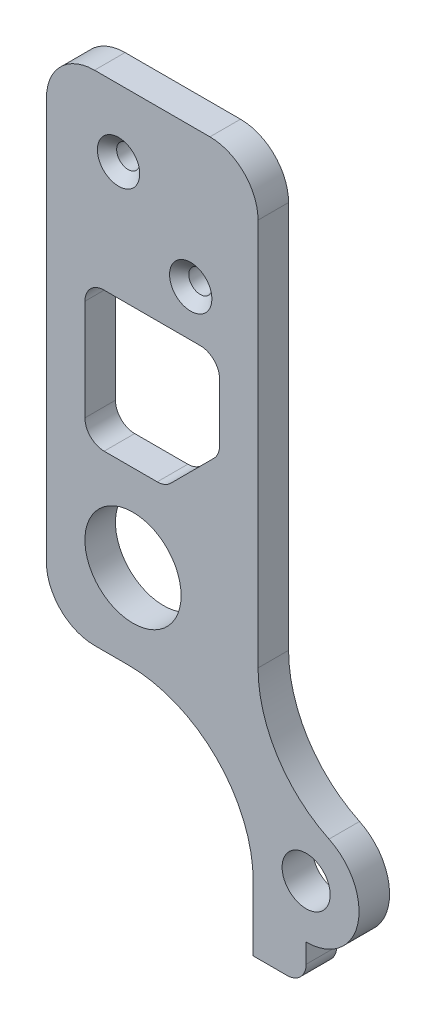
ISO-10303-21;
HEADER;
FILE_DESCRIPTION(('STEP AP214'),'2;1');
FILE_NAME('part.step','',(''),(''),'','','');
FILE_SCHEMA(('AUTOMOTIVE_DESIGN { 1 0 10303 214 1 1 1 1 }'));
ENDSEC;
DATA;
#1=APPLICATION_CONTEXT('core data for automotive mechanical design processes');
#2=APPLICATION_PROTOCOL_DEFINITION('international standard','automotive_design',2000,#1);
#3=PRODUCT_CONTEXT('',#1,'mechanical');
#4=PRODUCT('Part','Part','',(#3));
#5=PRODUCT_RELATED_PRODUCT_CATEGORY('part','',(#4));
#6=PRODUCT_DEFINITION_FORMATION('','',#4);
#7=PRODUCT_DEFINITION_CONTEXT('part definition',#1,'design');
#8=PRODUCT_DEFINITION('design','',#6,#7);
#9=PRODUCT_DEFINITION_SHAPE('','',#8);
#10=(LENGTH_UNIT() NAMED_UNIT(*) SI_UNIT(.MILLI.,.METRE.));
#11=(NAMED_UNIT(*) PLANE_ANGLE_UNIT() SI_UNIT($,.RADIAN.));
#12=(NAMED_UNIT(*) SI_UNIT($,.STERADIAN.) SOLID_ANGLE_UNIT());
#13=UNCERTAINTY_MEASURE_WITH_UNIT(LENGTH_MEASURE(1.E-05),#10,'distance_accuracy_value','');
#14=(GEOMETRIC_REPRESENTATION_CONTEXT(3) GLOBAL_UNCERTAINTY_ASSIGNED_CONTEXT((#13)) GLOBAL_UNIT_ASSIGNED_CONTEXT((#10,
#11,#12)) REPRESENTATION_CONTEXT('',''));
#15=CARTESIAN_POINT('',(0.,0.,0.));
#16=DIRECTION('',(0.,0.,1.));
#17=DIRECTION('',(1.,0.,0.));
#18=AXIS2_PLACEMENT_3D('',#15,#16,#17);
#19=CARTESIAN_POINT('',(0.,0.,3.175));
#20=DIRECTION('',(0.,0.,-1.));
#21=DIRECTION('',(-1.,0.,0.));
#22=AXIS2_PLACEMENT_3D('',#19,#20,#21);
#23=CYLINDRICAL_SURFACE('',#22,5.5);
#24=CARTESIAN_POINT('',(0.,0.,0.));
#25=DIRECTION('',(0.,0.,1.));
#26=DIRECTION('',(1.,0.,0.));
#27=AXIS2_PLACEMENT_3D('',#24,#25,#26);
#28=CIRCLE('',#27,5.5);
#29=CARTESIAN_POINT('',(0.,-5.5,0.));
#30=VERTEX_POINT('',#29);
#31=CARTESIAN_POINT('',(2.37837837837838,4.95916487820906,0.));
#32=VERTEX_POINT('',#31);
#33=EDGE_CURVE('E213',#30,#32,#28,.T.);
#34=ORIENTED_EDGE('',*,*,#33,.T.);
#35=DIRECTION('',(0.,0.,-1.));
#36=VECTOR('',#35,1.);
#37=CARTESIAN_POINT('',(2.37837837837838,4.95916487820906,3.175));
#38=LINE('',#37,#36);
#39=CARTESIAN_POINT('',(2.37837837837838,4.95916487820906,3.175));
#40=VERTEX_POINT('',#39);
#41=EDGE_CURVE('E406',#32,#40,#38,.F.);
#42=ORIENTED_EDGE('',*,*,#41,.T.);
#43=CARTESIAN_POINT('',(0.,0.,3.175));
#44=DIRECTION('',(0.,0.,1.));
#45=DIRECTION('',(1.,0.,0.));
#46=AXIS2_PLACEMENT_3D('',#43,#44,#45);
#47=CIRCLE('',#46,5.5);
#48=CARTESIAN_POINT('',(0.,-5.5,3.175));
#49=VERTEX_POINT('',#48);
#50=EDGE_CURVE('E233',#49,#40,#47,.T.);
#51=ORIENTED_EDGE('',*,*,#50,.F.);
#52=DIRECTION('',(0.,0.,-1.));
#53=VECTOR('',#52,1.);
#54=CARTESIAN_POINT('',(0.,-5.5,3.175));
#55=LINE('',#54,#53);
#56=EDGE_CURVE('E334',#49,#30,#55,.T.);
#57=ORIENTED_EDGE('',*,*,#56,.T.);
#58=EDGE_LOOP('',(#34,#42,#51,#57));
#59=FACE_BOUND('',#58,.T.);
#60=ADVANCED_FACE('F34',(#59),#23,.T.);
#61=CARTESIAN_POINT('',(-5.,0.,3.175));
#62=DIRECTION('',(1.,0.,0.));
#63=DIRECTION('',(0.,1.,0.));
#64=AXIS2_PLACEMENT_3D('',#61,#62,#63);
#65=PLANE('',#64);
#66=DIRECTION('',(0.,-1.,0.));
#67=VECTOR('',#66,1.);
#68=CARTESIAN_POINT('',(-5.,0.,3.175));
#69=LINE('',#68,#67);
#70=CARTESIAN_POINT('',(-5.00000000000001,57.,3.175));
#71=VERTEX_POINT('',#70);
#72=CARTESIAN_POINT('',(-5.00000000000001,16.6808273176123,3.175));
#73=VERTEX_POINT('',#72);
#74=EDGE_CURVE('E333',#71,#73,#69,.T.);
#75=ORIENTED_EDGE('',*,*,#74,.T.);
#76=DIRECTION('',(0.,0.,-1.));
#77=VECTOR('',#76,1.);
#78=CARTESIAN_POINT('',(-5.00000000000001,16.6808273176123,3.175));
#79=LINE('',#78,#77);
#80=CARTESIAN_POINT('',(-5.00000000000001,16.6808273176123,0.));
#81=VERTEX_POINT('',#80);
#82=EDGE_CURVE('E49',#73,#81,#79,.T.);
#83=ORIENTED_EDGE('',*,*,#82,.T.);
#84=DIRECTION('',(0.,-1.,0.));
#85=VECTOR('',#84,1.);
#86=CARTESIAN_POINT('',(-5.,0.,0.));
#87=LINE('',#86,#85);
#88=CARTESIAN_POINT('',(-5.00000000000001,57.,0.));
#89=VERTEX_POINT('',#88);
#90=EDGE_CURVE('E221',#89,#81,#87,.T.);
#91=ORIENTED_EDGE('',*,*,#90,.F.);
#92=DIRECTION('',(0.,0.,-1.));
#93=VECTOR('',#92,1.);
#94=CARTESIAN_POINT('',(-5.00000000000001,57.,3.175));
#95=LINE('',#94,#93);
#96=EDGE_CURVE('E317',#89,#71,#95,.F.);
#97=ORIENTED_EDGE('',*,*,#96,.T.);
#98=EDGE_LOOP('',(#75,#83,#91,#97));
#99=FACE_BOUND('',#98,.T.);
#100=ADVANCED_FACE('F457',(#99),#65,.T.);
#101=CARTESIAN_POINT('',(0.,62.,3.175));
#102=DIRECTION('',(0.,1.,0.));
#103=DIRECTION('',(0.,0.,1.));
#104=AXIS2_PLACEMENT_3D('',#101,#102,#103);
#105=PLANE('',#104);
#106=DIRECTION('',(1.,0.,0.));
#107=VECTOR('',#106,1.);
#108=CARTESIAN_POINT('',(0.,62.,0.));
#109=LINE('',#108,#107);
#110=CARTESIAN_POINT('',(-22.,62.,0.));
#111=VERTEX_POINT('',#110);
#112=CARTESIAN_POINT('',(-10.,62.,0.));
#113=VERTEX_POINT('',#112);
#114=EDGE_CURVE('E330',#111,#113,#109,.T.);
#115=ORIENTED_EDGE('',*,*,#114,.F.);
#116=DIRECTION('',(0.,0.,-1.));
#117=VECTOR('',#116,1.);
#118=CARTESIAN_POINT('',(-22.,62.,3.175));
#119=LINE('',#118,#117);
#120=CARTESIAN_POINT('',(-22.,62.,3.175));
#121=VERTEX_POINT('',#120);
#122=EDGE_CURVE('E314',#111,#121,#119,.F.);
#123=ORIENTED_EDGE('',*,*,#122,.T.);
#124=DIRECTION('',(1.,0.,0.));
#125=VECTOR('',#124,1.);
#126=CARTESIAN_POINT('',(0.,62.,3.175));
#127=LINE('',#126,#125);
#128=CARTESIAN_POINT('',(-10.,62.,3.175));
#129=VERTEX_POINT('',#128);
#130=EDGE_CURVE('E316',#121,#129,#127,.T.);
#131=ORIENTED_EDGE('',*,*,#130,.T.);
#132=DIRECTION('',(0.,0.,-1.));
#133=VECTOR('',#132,1.);
#134=CARTESIAN_POINT('',(-10.,62.,3.175));
#135=LINE('',#134,#133);
#136=EDGE_CURVE('E255',#129,#113,#135,.T.);
#137=ORIENTED_EDGE('',*,*,#136,.T.);
#138=EDGE_LOOP('',(#115,#123,#131,#137));
#139=FACE_BOUND('',#138,.T.);
#140=ADVANCED_FACE('F450',(#139),#105,.T.);
#141=CARTESIAN_POINT('',(-27.,0.,3.175));
#142=DIRECTION('',(-1.,0.,0.));
#143=DIRECTION('',(0.,0.,1.));
#144=AXIS2_PLACEMENT_3D('',#141,#142,#143);
#145=PLANE('',#144);
#146=DIRECTION('',(0.,1.,0.));
#147=VECTOR('',#146,1.);
#148=CARTESIAN_POINT('',(-27.,0.,0.));
#149=LINE('',#148,#147);
#150=CARTESIAN_POINT('',(-27.,15.1996361330691,0.));
#151=VERTEX_POINT('',#150);
#152=CARTESIAN_POINT('',(-27.,57.,0.));
#153=VERTEX_POINT('',#152);
#154=EDGE_CURVE('E240',#151,#153,#149,.T.);
#155=ORIENTED_EDGE('',*,*,#154,.F.);
#156=DIRECTION('',(0.,0.,1.));
#157=VECTOR('',#156,1.);
#158=CARTESIAN_POINT('',(-27.,15.1996361330691,3.175));
#159=LINE('',#158,#157);
#160=CARTESIAN_POINT('',(-27.,15.1996361330691,3.175));
#161=VERTEX_POINT('',#160);
#162=EDGE_CURVE('E251',#151,#161,#159,.T.);
#163=ORIENTED_EDGE('',*,*,#162,.T.);
#164=DIRECTION('',(0.,1.,0.));
#165=VECTOR('',#164,1.);
#166=CARTESIAN_POINT('',(-27.,0.,3.175));
#167=LINE('',#166,#165);
#168=CARTESIAN_POINT('',(-27.,57.,3.175));
#169=VERTEX_POINT('',#168);
#170=EDGE_CURVE('E254',#161,#169,#167,.T.);
#171=ORIENTED_EDGE('',*,*,#170,.T.);
#172=DIRECTION('',(0.,0.,-1.));
#173=VECTOR('',#172,1.);
#174=CARTESIAN_POINT('',(-27.,57.,3.175));
#175=LINE('',#174,#173);
#176=EDGE_CURVE('E320',#169,#153,#175,.T.);
#177=ORIENTED_EDGE('',*,*,#176,.T.);
#178=EDGE_LOOP('',(#155,#163,#171,#177));
#179=FACE_BOUND('',#178,.T.);
#180=ADVANCED_FACE('F442',(#179),#145,.T.);
#181=CARTESIAN_POINT('',(0.,0.,3.175));
#182=DIRECTION('',(0.,0.,-1.));
#183=DIRECTION('',(-1.,0.,0.));
#184=AXIS2_PLACEMENT_3D('',#181,#182,#183);
#185=CYLINDRICAL_SURFACE('',#184,2.5);
#186=CARTESIAN_POINT('',(0.,0.,3.175));
#187=DIRECTION('',(0.,0.,1.));
#188=DIRECTION('',(1.,0.,0.));
#189=AXIS2_PLACEMENT_3D('',#186,#187,#188);
#190=CIRCLE('',#189,2.5);
#191=CARTESIAN_POINT('',(2.5,0.,3.175));
#192=VERTEX_POINT('',#191);
#193=EDGE_CURVE('E323',#192,#192,#190,.T.);
#194=ORIENTED_EDGE('',*,*,#193,.T.);
#195=EDGE_LOOP('',(#194));
#196=FACE_BOUND('',#195,.T.);
#197=CARTESIAN_POINT('',(0.,0.,0.));
#198=DIRECTION('',(0.,0.,1.));
#199=DIRECTION('',(1.,0.,0.));
#200=AXIS2_PLACEMENT_3D('',#197,#198,#199);
#201=CIRCLE('',#200,2.5);
#202=CARTESIAN_POINT('',(2.5,0.,0.));
#203=VERTEX_POINT('',#202);
#204=EDGE_CURVE('E220',#203,#203,#201,.T.);
#205=ORIENTED_EDGE('',*,*,#204,.F.);
#206=EDGE_LOOP('',(#205));
#207=FACE_BOUND('',#206,.T.);
#208=ADVANCED_FACE('F469',(#196,#207),#185,.F.);
#209=CARTESIAN_POINT('',(-18.,19.2,3.175));
#210=DIRECTION('',(0.,0.,-1.));
#211=DIRECTION('',(-1.,0.,0.));
#212=AXIS2_PLACEMENT_3D('',#209,#210,#211);
#213=CYLINDRICAL_SURFACE('',#212,5.);
#214=CARTESIAN_POINT('',(-18.,19.2,3.175));
#215=DIRECTION('',(0.,0.,1.));
#216=DIRECTION('',(1.,0.,0.));
#217=AXIS2_PLACEMENT_3D('',#214,#215,#216);
#218=CIRCLE('',#217,5.);
#219=CARTESIAN_POINT('',(-13.,19.2,3.175));
#220=VERTEX_POINT('',#219);
#221=EDGE_CURVE('E350',#220,#220,#218,.T.);
#222=ORIENTED_EDGE('',*,*,#221,.T.);
#223=EDGE_LOOP('',(#222));
#224=FACE_BOUND('',#223,.T.);
#225=CARTESIAN_POINT('',(-18.,19.2,0.));
#226=DIRECTION('',(0.,0.,1.));
#227=DIRECTION('',(1.,0.,0.));
#228=AXIS2_PLACEMENT_3D('',#225,#226,#227);
#229=CIRCLE('',#228,5.);
#230=CARTESIAN_POINT('',(-13.,19.2,0.));
#231=VERTEX_POINT('',#230);
#232=EDGE_CURVE('E224',#231,#231,#229,.T.);
#233=ORIENTED_EDGE('',*,*,#232,.F.);
#234=EDGE_LOOP('',(#233));
#235=FACE_BOUND('',#234,.T.);
#236=ADVANCED_FACE('F524',(#224,#235),#213,.F.);
#237=CARTESIAN_POINT('',(0.,0.,3.175));
#238=DIRECTION('',(0.,0.,1.));
#239=DIRECTION('',(1.,0.,0.));
#240=AXIS2_PLACEMENT_3D('',#237,#238,#239);
#241=PLANE('',#240);
#242=DIRECTION('',(-1.,0.,0.));
#243=VECTOR('',#242,1.);
#244=CARTESIAN_POINT('',(-17.1,10.1996361330691,3.175));
#245=LINE('',#244,#243);
#246=CARTESIAN_POINT('',(-18.5,10.1996361330691,3.175));
#247=VERTEX_POINT('',#246);
#248=CARTESIAN_POINT('',(-22.,10.1996361330691,3.175));
#249=VERTEX_POINT('',#248);
#250=EDGE_CURVE('E245',#247,#249,#245,.T.);
#251=ORIENTED_EDGE('',*,*,#250,.F.);
#252=CARTESIAN_POINT('',(-18.5,-2.80036386693086,3.175));
#253=DIRECTION('',(0.,0.,1.));
#254=DIRECTION('',(1.,0.,0.));
#255=AXIS2_PLACEMENT_3D('',#252,#253,#254);
#256=CIRCLE('',#255,13.);
#257=CARTESIAN_POINT('',(-5.5,-2.80036386693086,3.175));
#258=VERTEX_POINT('',#257);
#259=EDGE_CURVE('E404',#247,#258,#256,.F.);
#260=ORIENTED_EDGE('',*,*,#259,.T.);
#261=DIRECTION('',(0.,-1.,0.));
#262=VECTOR('',#261,1.);
#263=CARTESIAN_POINT('',(-5.5,0.,3.175));
#264=LINE('',#263,#262);
#265=CARTESIAN_POINT('',(-5.5,-9.5,3.175));
#266=VERTEX_POINT('',#265);
#267=EDGE_CURVE('E234',#258,#266,#264,.T.);
#268=ORIENTED_EDGE('',*,*,#267,.T.);
#269=DIRECTION('',(-1.,0.,0.));
#270=VECTOR('',#269,1.);
#271=CARTESIAN_POINT('',(0.,-9.5,3.175));
#272=LINE('',#271,#270);
#273=CARTESIAN_POINT('',(-2.,-9.5,3.175));
#274=VERTEX_POINT('',#273);
#275=EDGE_CURVE('E236',#274,#266,#272,.T.);
#276=ORIENTED_EDGE('',*,*,#275,.F.);
#277=CARTESIAN_POINT('',(-2.,-7.5,3.175));
#278=DIRECTION('',(0.,0.,1.));
#279=DIRECTION('',(1.,0.,0.));
#280=AXIS2_PLACEMENT_3D('',#277,#278,#279);
#281=CIRCLE('',#280,2.);
#282=CARTESIAN_POINT('',(0.,-7.5,3.175));
#283=VERTEX_POINT('',#282);
#284=EDGE_CURVE('E231',#274,#283,#281,.T.);
#285=ORIENTED_EDGE('',*,*,#284,.T.);
#286=DIRECTION('',(0.,-1.,0.));
#287=VECTOR('',#286,1.);
#288=CARTESIAN_POINT('',(0.,0.,3.175));
#289=LINE('',#288,#287);
#290=EDGE_CURVE('E201',#49,#283,#289,.T.);
#291=ORIENTED_EDGE('',*,*,#290,.F.);
#292=ORIENTED_EDGE('',*,*,#50,.T.);
#293=CARTESIAN_POINT('',(7.99999999999999,16.6808273176123,3.175));
#294=DIRECTION('',(0.,0.,1.));
#295=DIRECTION('',(1.,0.,0.));
#296=AXIS2_PLACEMENT_3D('',#293,#294,#295);
#297=CIRCLE('',#296,13.);
#298=EDGE_CURVE('E42',#40,#73,#297,.F.);
#299=ORIENTED_EDGE('',*,*,#298,.T.);
#300=ORIENTED_EDGE('',*,*,#74,.F.);
#301=CARTESIAN_POINT('',(-10.,57.,3.175));
#302=DIRECTION('',(0.,0.,1.));
#303=DIRECTION('',(1.,0.,0.));
#304=AXIS2_PLACEMENT_3D('',#301,#302,#303);
#305=CIRCLE('',#304,5.);
#306=EDGE_CURVE('E326',#71,#129,#305,.T.);
#307=ORIENTED_EDGE('',*,*,#306,.T.);
#308=ORIENTED_EDGE('',*,*,#130,.F.);
#309=CARTESIAN_POINT('',(-22.,57.,3.175));
#310=DIRECTION('',(0.,0.,1.));
#311=DIRECTION('',(1.,0.,0.));
#312=AXIS2_PLACEMENT_3D('',#309,#310,#311);
#313=CIRCLE('',#312,5.);
#314=EDGE_CURVE('E250',#121,#169,#313,.T.);
#315=ORIENTED_EDGE('',*,*,#314,.T.);
#316=ORIENTED_EDGE('',*,*,#170,.F.);
#317=CARTESIAN_POINT('',(-22.,15.1996361330691,3.175));
#318=DIRECTION('',(0.,0.,1.));
#319=DIRECTION('',(1.,0.,0.));
#320=AXIS2_PLACEMENT_3D('',#317,#318,#319);
#321=CIRCLE('',#320,5.);
#322=EDGE_CURVE('E246',#161,#249,#321,.T.);
#323=ORIENTED_EDGE('',*,*,#322,.T.);
#324=EDGE_LOOP('',(#251,#260,#268,#276,#285,#291,#292,#299,#300,#307,#308,#315,#316,#323));
#325=FACE_BOUND('',#324,.T.);
#326=DIRECTION('',(1.,0.,0.));
#327=VECTOR('',#326,1.);
#328=CARTESIAN_POINT('',(-23.,28.1963214100198,3.175));
#329=LINE('',#328,#327);
#330=CARTESIAN_POINT('',(-21.,28.1963214100198,3.175));
#331=VERTEX_POINT('',#330);
#332=CARTESIAN_POINT('',(-15.4791374249044,28.1963214100198,3.175));
#333=VERTEX_POINT('',#332);
#334=EDGE_CURVE('E286',#331,#333,#329,.T.);
#335=ORIENTED_EDGE('',*,*,#334,.F.);
#336=CARTESIAN_POINT('',(-21.,30.1963214100198,3.175));
#337=DIRECTION('',(0.,0.,1.));
#338=DIRECTION('',(1.,0.,0.));
#339=AXIS2_PLACEMENT_3D('',#336,#337,#338);
#340=CIRCLE('',#339,2.);
#341=CARTESIAN_POINT('',(-23.,30.1963214100198,3.175));
#342=VERTEX_POINT('',#341);
#343=EDGE_CURVE('E249',#331,#342,#340,.F.);
#344=ORIENTED_EDGE('',*,*,#343,.T.);
#345=DIRECTION('',(0.,1.,0.));
#346=VECTOR('',#345,1.);
#347=CARTESIAN_POINT('',(-23.,28.1963214100198,3.175));
#348=LINE('',#347,#346);
#349=CARTESIAN_POINT('',(-23.,40.6963214100198,3.175));
#350=VERTEX_POINT('',#349);
#351=EDGE_CURVE('E268',#342,#350,#348,.T.);
#352=ORIENTED_EDGE('',*,*,#351,.T.);
#353=CARTESIAN_POINT('',(-21.,40.6963214100198,3.175));
#354=DIRECTION('',(0.,0.,1.));
#355=DIRECTION('',(1.,0.,0.));
#356=AXIS2_PLACEMENT_3D('',#353,#354,#355);
#357=CIRCLE('',#356,2.);
#358=CARTESIAN_POINT('',(-21.,42.6963214100198,3.175));
#359=VERTEX_POINT('',#358);
#360=EDGE_CURVE('E281',#350,#359,#357,.F.);
#361=ORIENTED_EDGE('',*,*,#360,.T.);
#362=DIRECTION('',(1.,0.,0.));
#363=VECTOR('',#362,1.);
#364=CARTESIAN_POINT('',(-23.,42.6963214100198,3.175));
#365=LINE('',#364,#363);
#366=CARTESIAN_POINT('',(-11.,42.6963214100198,3.175));
#367=VERTEX_POINT('',#366);
#368=EDGE_CURVE('E275',#359,#367,#365,.T.);
#369=ORIENTED_EDGE('',*,*,#368,.T.);
#370=CARTESIAN_POINT('',(-11.,40.6963214100198,3.175));
#371=DIRECTION('',(0.,0.,1.));
#372=DIRECTION('',(1.,0.,0.));
#373=AXIS2_PLACEMENT_3D('',#370,#371,#372);
#374=CIRCLE('',#373,2.);
#375=CARTESIAN_POINT('',(-9.00000000000001,40.6963214100198,3.175));
#376=VERTEX_POINT('',#375);
#377=EDGE_CURVE('E272',#367,#376,#374,.F.);
#378=ORIENTED_EDGE('',*,*,#377,.T.);
#379=DIRECTION('',(0.,-1.,0.));
#380=VECTOR('',#379,1.);
#381=CARTESIAN_POINT('',(-9.00000000000001,42.6963214100198,3.175));
#382=LINE('',#381,#380);
#383=CARTESIAN_POINT('',(-9.00000000000001,34.6808926624324,3.175));
#384=VERTEX_POINT('',#383);
#385=EDGE_CURVE('E274',#376,#384,#382,.T.);
#386=ORIENTED_EDGE('',*,*,#385,.T.);
#387=CARTESIAN_POINT('',(-11.,34.6808926624324,3.175));
#388=DIRECTION('',(0.,0.,1.));
#389=DIRECTION('',(1.,0.,0.));
#390=AXIS2_PLACEMENT_3D('',#387,#388,#389);
#391=CIRCLE('',#390,2.);
#392=CARTESIAN_POINT('',(-9.58492939706356,33.2675366603207,3.175));
#393=VERTEX_POINT('',#392);
#394=EDGE_CURVE('E277',#384,#393,#391,.F.);
#395=ORIENTED_EDGE('',*,*,#394,.T.);
#396=DIRECTION('',(-0.706678001055834,-0.707535301468224,0.));
#397=VECTOR('',#396,1.);
#398=CARTESIAN_POINT('',(-9.00000000000001,33.8531756595122,3.175));
#399=LINE('',#398,#397);
#400=CARTESIAN_POINT('',(-14.064066821968,28.7829654079082,3.175));
#401=VERTEX_POINT('',#400);
#402=EDGE_CURVE('E263',#393,#401,#399,.T.);
#403=ORIENTED_EDGE('',*,*,#402,.T.);
#404=CARTESIAN_POINT('',(-15.4791374249044,30.1963214100198,3.175));
#405=DIRECTION('',(0.,0.,1.));
#406=DIRECTION('',(1.,0.,0.));
#407=AXIS2_PLACEMENT_3D('',#404,#405,#406);
#408=CIRCLE('',#407,2.);
#409=EDGE_CURVE('E260',#401,#333,#408,.F.);
#410=ORIENTED_EDGE('',*,*,#409,.T.);
#411=EDGE_LOOP('',(#335,#344,#352,#361,#369,#378,#386,#395,#403,#410));
#412=FACE_BOUND('',#411,.T.);
#413=CARTESIAN_POINT('',(-19.5,55.,3.175));
#414=DIRECTION('',(0.,0.,1.));
#415=DIRECTION('',(1.,0.,0.));
#416=AXIS2_PLACEMENT_3D('',#413,#414,#415);
#417=CIRCLE('',#416,2.2);
#418=CARTESIAN_POINT('',(-17.3,55.,3.175));
#419=VERTEX_POINT('',#418);
#420=EDGE_CURVE('E287',#419,#419,#417,.T.);
#421=ORIENTED_EDGE('',*,*,#420,.F.);
#422=EDGE_LOOP('',(#421));
#423=FACE_BOUND('',#422,.T.);
#424=CARTESIAN_POINT('',(-12.,47.5,3.175));
#425=DIRECTION('',(0.,0.,1.));
#426=DIRECTION('',(1.,0.,0.));
#427=AXIS2_PLACEMENT_3D('',#424,#425,#426);
#428=CIRCLE('',#427,2.2);
#429=CARTESIAN_POINT('',(-9.8,47.5,3.175));
#430=VERTEX_POINT('',#429);
#431=EDGE_CURVE('E357',#430,#430,#428,.T.);
#432=ORIENTED_EDGE('',*,*,#431,.F.);
#433=EDGE_LOOP('',(#432));
#434=FACE_BOUND('',#433,.T.);
#435=ORIENTED_EDGE('',*,*,#221,.F.);
#436=EDGE_LOOP('',(#435));
#437=FACE_BOUND('',#436,.T.);
#438=ORIENTED_EDGE('',*,*,#193,.F.);
#439=EDGE_LOOP('',(#438));
#440=FACE_BOUND('',#439,.T.);
#441=ADVANCED_FACE('F415',(#325,#412,#423,#434,#437,#440),#241,.T.);
#442=CARTESIAN_POINT('',(0.,0.,0.));
#443=DIRECTION('',(0.,0.,1.));
#444=DIRECTION('',(1.,0.,0.));
#445=AXIS2_PLACEMENT_3D('',#442,#443,#444);
#446=PLANE('',#445);
#447=DIRECTION('',(0.,1.,0.));
#448=VECTOR('',#447,1.);
#449=CARTESIAN_POINT('',(-5.5,0.,0.));
#450=LINE('',#449,#448);
#451=CARTESIAN_POINT('',(-5.5,-9.5,0.));
#452=VERTEX_POINT('',#451);
#453=CARTESIAN_POINT('',(-5.5,-2.80036386693086,0.));
#454=VERTEX_POINT('',#453);
#455=EDGE_CURVE('E262',#452,#454,#450,.T.);
#456=ORIENTED_EDGE('',*,*,#455,.T.);
#457=CARTESIAN_POINT('',(-18.5,-2.80036386693086,0.));
#458=DIRECTION('',(0.,0.,1.));
#459=DIRECTION('',(1.,0.,0.));
#460=AXIS2_PLACEMENT_3D('',#457,#458,#459);
#461=CIRCLE('',#460,13.);
#462=CARTESIAN_POINT('',(-18.5,10.1996361330691,0.));
#463=VERTEX_POINT('',#462);
#464=EDGE_CURVE('E402',#454,#463,#461,.T.);
#465=ORIENTED_EDGE('',*,*,#464,.T.);
#466=DIRECTION('',(-1.,0.,0.));
#467=VECTOR('',#466,1.);
#468=CARTESIAN_POINT('',(0.,10.1996361330691,0.));
#469=LINE('',#468,#467);
#470=CARTESIAN_POINT('',(-22.,10.1996361330691,0.));
#471=VERTEX_POINT('',#470);
#472=EDGE_CURVE('E241',#463,#471,#469,.T.);
#473=ORIENTED_EDGE('',*,*,#472,.T.);
#474=CARTESIAN_POINT('',(-22.,15.1996361330691,0.));
#475=DIRECTION('',(0.,0.,1.));
#476=DIRECTION('',(1.,0.,0.));
#477=AXIS2_PLACEMENT_3D('',#474,#475,#476);
#478=CIRCLE('',#477,5.);
#479=EDGE_CURVE('E238',#471,#151,#478,.F.);
#480=ORIENTED_EDGE('',*,*,#479,.T.);
#481=ORIENTED_EDGE('',*,*,#154,.T.);
#482=CARTESIAN_POINT('',(-22.,57.,0.));
#483=DIRECTION('',(0.,0.,1.));
#484=DIRECTION('',(1.,0.,0.));
#485=AXIS2_PLACEMENT_3D('',#482,#483,#484);
#486=CIRCLE('',#485,5.);
#487=EDGE_CURVE('E328',#153,#111,#486,.F.);
#488=ORIENTED_EDGE('',*,*,#487,.T.);
#489=ORIENTED_EDGE('',*,*,#114,.T.);
#490=CARTESIAN_POINT('',(-10.,57.,0.));
#491=DIRECTION('',(0.,0.,1.));
#492=DIRECTION('',(1.,0.,0.));
#493=AXIS2_PLACEMENT_3D('',#490,#491,#492);
#494=CIRCLE('',#493,5.);
#495=EDGE_CURVE('E226',#113,#89,#494,.F.);
#496=ORIENTED_EDGE('',*,*,#495,.T.);
#497=ORIENTED_EDGE('',*,*,#90,.T.);
#498=CARTESIAN_POINT('',(7.99999999999999,16.6808273176123,0.));
#499=DIRECTION('',(0.,0.,1.));
#500=DIRECTION('',(1.,0.,0.));
#501=AXIS2_PLACEMENT_3D('',#498,#499,#500);
#502=CIRCLE('',#501,13.);
#503=EDGE_CURVE('E11',#81,#32,#502,.T.);
#504=ORIENTED_EDGE('',*,*,#503,.T.);
#505=ORIENTED_EDGE('',*,*,#33,.F.);
#506=DIRECTION('',(0.,1.,0.));
#507=VECTOR('',#506,1.);
#508=CARTESIAN_POINT('',(0.,0.,0.));
#509=LINE('',#508,#507);
#510=CARTESIAN_POINT('',(0.,-7.5,0.));
#511=VERTEX_POINT('',#510);
#512=EDGE_CURVE('E198',#511,#30,#509,.T.);
#513=ORIENTED_EDGE('',*,*,#512,.F.);
#514=CARTESIAN_POINT('',(-2.,-7.5,0.));
#515=DIRECTION('',(0.,0.,1.));
#516=DIRECTION('',(1.,0.,0.));
#517=AXIS2_PLACEMENT_3D('',#514,#515,#516);
#518=CIRCLE('',#517,2.);
#519=CARTESIAN_POINT('',(-2.,-9.5,0.));
#520=VERTEX_POINT('',#519);
#521=EDGE_CURVE('E210',#511,#520,#518,.F.);
#522=ORIENTED_EDGE('',*,*,#521,.T.);
#523=DIRECTION('',(1.,0.,0.));
#524=VECTOR('',#523,1.);
#525=CARTESIAN_POINT('',(0.,-9.5,0.));
#526=LINE('',#525,#524);
#527=EDGE_CURVE('E237',#452,#520,#526,.T.);
#528=ORIENTED_EDGE('',*,*,#527,.F.);
#529=EDGE_LOOP('',(#456,#465,#473,#480,#481,#488,#489,#496,#497,#504,#505,#513,#522,#528));
#530=FACE_BOUND('',#529,.T.);
#531=ORIENTED_EDGE('',*,*,#204,.T.);
#532=EDGE_LOOP('',(#531));
#533=FACE_BOUND('',#532,.T.);
#534=ORIENTED_EDGE('',*,*,#232,.T.);
#535=EDGE_LOOP('',(#534));
#536=FACE_BOUND('',#535,.T.);
#537=CARTESIAN_POINT('',(-12.,47.5,0.));
#538=DIRECTION('',(0.,0.,1.));
#539=DIRECTION('',(1.,0.,0.));
#540=AXIS2_PLACEMENT_3D('',#537,#538,#539);
#541=CIRCLE('',#540,1.2);
#542=CARTESIAN_POINT('',(-10.8,47.5,0.));
#543=VERTEX_POINT('',#542);
#544=EDGE_CURVE('E342',#543,#543,#541,.T.);
#545=ORIENTED_EDGE('',*,*,#544,.T.);
#546=EDGE_LOOP('',(#545));
#547=FACE_BOUND('',#546,.T.);
#548=CARTESIAN_POINT('',(-19.5,55.,0.));
#549=DIRECTION('',(0.,0.,1.));
#550=DIRECTION('',(1.,0.,0.));
#551=AXIS2_PLACEMENT_3D('',#548,#549,#550);
#552=CIRCLE('',#551,1.2);
#553=CARTESIAN_POINT('',(-18.3,55.,0.));
#554=VERTEX_POINT('',#553);
#555=EDGE_CURVE('E266',#554,#554,#552,.T.);
#556=ORIENTED_EDGE('',*,*,#555,.T.);
#557=EDGE_LOOP('',(#556));
#558=FACE_BOUND('',#557,.T.);
#559=DIRECTION('',(0.,1.,0.));
#560=VECTOR('',#559,1.);
#561=CARTESIAN_POINT('',(-23.,28.1963214100198,0.));
#562=LINE('',#561,#560);
#563=CARTESIAN_POINT('',(-23.,30.1963214100198,0.));
#564=VERTEX_POINT('',#563);
#565=CARTESIAN_POINT('',(-23.,40.6963214100198,0.));
#566=VERTEX_POINT('',#565);
#567=EDGE_CURVE('E290',#564,#566,#562,.T.);
#568=ORIENTED_EDGE('',*,*,#567,.F.);
#569=CARTESIAN_POINT('',(-21.,30.1963214100198,0.));
#570=DIRECTION('',(0.,0.,1.));
#571=DIRECTION('',(1.,0.,0.));
#572=AXIS2_PLACEMENT_3D('',#569,#570,#571);
#573=CIRCLE('',#572,2.);
#574=CARTESIAN_POINT('',(-21.,28.1963214100198,0.));
#575=VERTEX_POINT('',#574);
#576=EDGE_CURVE('E264',#564,#575,#573,.T.);
#577=ORIENTED_EDGE('',*,*,#576,.T.);
#578=DIRECTION('',(1.,0.,0.));
#579=VECTOR('',#578,1.);
#580=CARTESIAN_POINT('',(-23.,28.1963214100198,0.));
#581=LINE('',#580,#579);
#582=CARTESIAN_POINT('',(-15.4791374249044,28.1963214100198,0.));
#583=VERTEX_POINT('',#582);
#584=EDGE_CURVE('E259',#575,#583,#581,.T.);
#585=ORIENTED_EDGE('',*,*,#584,.T.);
#586=CARTESIAN_POINT('',(-15.4791374249044,30.1963214100198,0.));
#587=DIRECTION('',(0.,0.,1.));
#588=DIRECTION('',(1.,0.,0.));
#589=AXIS2_PLACEMENT_3D('',#586,#587,#588);
#590=CIRCLE('',#589,2.);
#591=CARTESIAN_POINT('',(-14.064066821968,28.7829654079082,0.));
#592=VERTEX_POINT('',#591);
#593=EDGE_CURVE('E256',#583,#592,#590,.T.);
#594=ORIENTED_EDGE('',*,*,#593,.T.);
#595=DIRECTION('',(-0.706678001055834,-0.707535301468224,0.));
#596=VECTOR('',#595,1.);
#597=CARTESIAN_POINT('',(-9.00000000000001,33.8531756595122,0.));
#598=LINE('',#597,#596);
#599=CARTESIAN_POINT('',(-9.58492939706356,33.2675366603207,0.));
#600=VERTEX_POINT('',#599);
#601=EDGE_CURVE('E293',#600,#592,#598,.T.);
#602=ORIENTED_EDGE('',*,*,#601,.F.);
#603=CARTESIAN_POINT('',(-11.,34.6808926624324,0.));
#604=DIRECTION('',(0.,0.,1.));
#605=DIRECTION('',(1.,0.,0.));
#606=AXIS2_PLACEMENT_3D('',#603,#604,#605);
#607=CIRCLE('',#606,2.);
#608=CARTESIAN_POINT('',(-9.00000000000001,34.6808926624324,0.));
#609=VERTEX_POINT('',#608);
#610=EDGE_CURVE('E258',#600,#609,#607,.T.);
#611=ORIENTED_EDGE('',*,*,#610,.T.);
#612=DIRECTION('',(0.,-1.,0.));
#613=VECTOR('',#612,1.);
#614=CARTESIAN_POINT('',(-9.00000000000001,42.6963214100198,0.));
#615=LINE('',#614,#613);
#616=CARTESIAN_POINT('',(-9.00000000000001,40.6963214100198,0.));
#617=VERTEX_POINT('',#616);
#618=EDGE_CURVE('E301',#617,#609,#615,.T.);
#619=ORIENTED_EDGE('',*,*,#618,.F.);
#620=CARTESIAN_POINT('',(-11.,40.6963214100198,0.));
#621=DIRECTION('',(0.,0.,1.));
#622=DIRECTION('',(1.,0.,0.));
#623=AXIS2_PLACEMENT_3D('',#620,#621,#622);
#624=CIRCLE('',#623,2.);
#625=CARTESIAN_POINT('',(-11.,42.6963214100198,0.));
#626=VERTEX_POINT('',#625);
#627=EDGE_CURVE('E269',#617,#626,#624,.T.);
#628=ORIENTED_EDGE('',*,*,#627,.T.);
#629=DIRECTION('',(1.,0.,0.));
#630=VECTOR('',#629,1.);
#631=CARTESIAN_POINT('',(-23.,42.6963214100198,0.));
#632=LINE('',#631,#630);
#633=CARTESIAN_POINT('',(-21.,42.6963214100198,0.));
#634=VERTEX_POINT('',#633);
#635=EDGE_CURVE('E305',#634,#626,#632,.T.);
#636=ORIENTED_EDGE('',*,*,#635,.F.);
#637=CARTESIAN_POINT('',(-21.,40.6963214100198,0.));
#638=DIRECTION('',(0.,0.,1.));
#639=DIRECTION('',(1.,0.,0.));
#640=AXIS2_PLACEMENT_3D('',#637,#638,#639);
#641=CIRCLE('',#640,2.);
#642=EDGE_CURVE('E271',#634,#566,#641,.T.);
#643=ORIENTED_EDGE('',*,*,#642,.T.);
#644=EDGE_LOOP('',(#568,#577,#585,#594,#602,#611,#619,#628,#636,#643));
#645=FACE_BOUND('',#644,.T.);
#646=ADVANCED_FACE('F208',(#530,#533,#536,#547,#558,#645),#446,.F.);
#647=CARTESIAN_POINT('',(-12.,47.5,3.175));
#648=DIRECTION('',(0.,0.,1.));
#649=DIRECTION('',(1.,0.,0.));
#650=AXIS2_PLACEMENT_3D('',#647,#648,#649);
#651=CYLINDRICAL_SURFACE('',#650,1.2);
#652=ORIENTED_EDGE('',*,*,#544,.F.);
#653=EDGE_LOOP('',(#652));
#654=FACE_BOUND('',#653,.T.);
#655=CARTESIAN_POINT('',(-12.,47.5,2.175));
#656=DIRECTION('',(0.,0.,1.));
#657=DIRECTION('',(1.,0.,0.));
#658=AXIS2_PLACEMENT_3D('',#655,#656,#657);
#659=CIRCLE('',#658,1.2);
#660=CARTESIAN_POINT('',(-10.8,47.5,2.175));
#661=VERTEX_POINT('',#660);
#662=EDGE_CURVE('E280',#661,#661,#659,.T.);
#663=ORIENTED_EDGE('',*,*,#662,.T.);
#664=EDGE_LOOP('',(#663));
#665=FACE_BOUND('',#664,.T.);
#666=ADVANCED_FACE('F476',(#654,#665),#651,.F.);
#667=CARTESIAN_POINT('',(-12.,47.5,3.175));
#668=DIRECTION('',(0.,0.,1.));
#669=DIRECTION('',(1.,0.,0.));
#670=AXIS2_PLACEMENT_3D('',#667,#668,#669);
#671=CONICAL_SURFACE('',#670,2.2,0.785398163397448);
#672=ORIENTED_EDGE('',*,*,#662,.F.);
#673=EDGE_LOOP('',(#672));
#674=FACE_BOUND('',#673,.T.);
#675=ORIENTED_EDGE('',*,*,#431,.T.);
#676=EDGE_LOOP('',(#675));
#677=FACE_BOUND('',#676,.T.);
#678=ADVANCED_FACE('F479',(#674,#677),#671,.F.);
#679=CARTESIAN_POINT('',(-19.5,55.,3.175));
#680=DIRECTION('',(0.,0.,1.));
#681=DIRECTION('',(1.,0.,0.));
#682=AXIS2_PLACEMENT_3D('',#679,#680,#681);
#683=CYLINDRICAL_SURFACE('',#682,1.2);
#684=ORIENTED_EDGE('',*,*,#555,.F.);
#685=EDGE_LOOP('',(#684));
#686=FACE_BOUND('',#685,.T.);
#687=CARTESIAN_POINT('',(-19.5,55.,2.175));
#688=DIRECTION('',(0.,0.,1.));
#689=DIRECTION('',(1.,0.,0.));
#690=AXIS2_PLACEMENT_3D('',#687,#688,#689);
#691=CIRCLE('',#690,1.2);
#692=CARTESIAN_POINT('',(-18.3,55.,2.175));
#693=VERTEX_POINT('',#692);
#694=EDGE_CURVE('E360',#693,#693,#691,.T.);
#695=ORIENTED_EDGE('',*,*,#694,.T.);
#696=EDGE_LOOP('',(#695));
#697=FACE_BOUND('',#696,.T.);
#698=ADVANCED_FACE('F483',(#686,#697),#683,.F.);
#699=CARTESIAN_POINT('',(-19.5,55.,3.175));
#700=DIRECTION('',(0.,0.,1.));
#701=DIRECTION('',(1.,0.,0.));
#702=AXIS2_PLACEMENT_3D('',#699,#700,#701);
#703=CONICAL_SURFACE('',#702,2.2,0.785398163397448);
#704=ORIENTED_EDGE('',*,*,#694,.F.);
#705=EDGE_LOOP('',(#704));
#706=FACE_BOUND('',#705,.T.);
#707=ORIENTED_EDGE('',*,*,#420,.T.);
#708=EDGE_LOOP('',(#707));
#709=FACE_BOUND('',#708,.T.);
#710=ADVANCED_FACE('F487',(#706,#709),#703,.F.);
#711=CARTESIAN_POINT('',(-23.,28.1963214100198,0.));
#712=DIRECTION('',(0.,-1.,0.));
#713=DIRECTION('',(0.,0.,-1.));
#714=AXIS2_PLACEMENT_3D('',#711,#712,#713);
#715=PLANE('',#714);
#716=ORIENTED_EDGE('',*,*,#584,.F.);
#717=DIRECTION('',(0.,0.,1.));
#718=VECTOR('',#717,1.);
#719=CARTESIAN_POINT('',(-21.,28.1963214100198,0.));
#720=LINE('',#719,#718);
#721=EDGE_CURVE('E283',#575,#331,#720,.T.);
#722=ORIENTED_EDGE('',*,*,#721,.T.);
#723=ORIENTED_EDGE('',*,*,#334,.T.);
#724=DIRECTION('',(0.,0.,1.));
#725=VECTOR('',#724,1.);
#726=CARTESIAN_POINT('',(-15.4791374249044,28.1963214100198,0.));
#727=LINE('',#726,#725);
#728=EDGE_CURVE('E288',#333,#583,#727,.F.);
#729=ORIENTED_EDGE('',*,*,#728,.T.);
#730=EDGE_LOOP('',(#716,#722,#723,#729));
#731=FACE_BOUND('',#730,.T.);
#732=ADVANCED_FACE('F491',(#731),#715,.F.);
#733=CARTESIAN_POINT('',(-23.,28.1963214100198,0.));
#734=DIRECTION('',(1.,0.,0.));
#735=DIRECTION('',(0.,1.,0.));
#736=AXIS2_PLACEMENT_3D('',#733,#734,#735);
#737=PLANE('',#736);
#738=ORIENTED_EDGE('',*,*,#567,.T.);
#739=DIRECTION('',(0.,0.,1.));
#740=VECTOR('',#739,1.);
#741=CARTESIAN_POINT('',(-23.,40.6963214100198,3.175));
#742=LINE('',#741,#740);
#743=EDGE_CURVE('E310',#566,#350,#742,.T.);
#744=ORIENTED_EDGE('',*,*,#743,.T.);
#745=ORIENTED_EDGE('',*,*,#351,.F.);
#746=DIRECTION('',(0.,0.,1.));
#747=VECTOR('',#746,1.);
#748=CARTESIAN_POINT('',(-23.,30.1963214100198,0.));
#749=LINE('',#748,#747);
#750=EDGE_CURVE('E306',#342,#564,#749,.F.);
#751=ORIENTED_EDGE('',*,*,#750,.T.);
#752=EDGE_LOOP('',(#738,#744,#745,#751));
#753=FACE_BOUND('',#752,.T.);
#754=ADVANCED_FACE('F495',(#753),#737,.T.);
#755=CARTESIAN_POINT('',(-23.,42.6963214100198,0.));
#756=DIRECTION('',(0.,-1.,0.));
#757=DIRECTION('',(0.,0.,-1.));
#758=AXIS2_PLACEMENT_3D('',#755,#756,#757);
#759=PLANE('',#758);
#760=ORIENTED_EDGE('',*,*,#368,.F.);
#761=DIRECTION('',(0.,0.,1.));
#762=VECTOR('',#761,1.);
#763=CARTESIAN_POINT('',(-21.,42.6963214100198,0.));
#764=LINE('',#763,#762);
#765=EDGE_CURVE('E303',#359,#634,#764,.F.);
#766=ORIENTED_EDGE('',*,*,#765,.T.);
#767=ORIENTED_EDGE('',*,*,#635,.T.);
#768=DIRECTION('',(0.,0.,1.));
#769=VECTOR('',#768,1.);
#770=CARTESIAN_POINT('',(-11.,42.6963214100198,3.175));
#771=LINE('',#770,#769);
#772=EDGE_CURVE('E307',#626,#367,#771,.T.);
#773=ORIENTED_EDGE('',*,*,#772,.T.);
#774=EDGE_LOOP('',(#760,#766,#767,#773));
#775=FACE_BOUND('',#774,.T.);
#776=ADVANCED_FACE('F504',(#775),#759,.T.);
#777=CARTESIAN_POINT('',(-9.00000000000001,42.6963214100198,0.));
#778=DIRECTION('',(-1.,0.,0.));
#779=DIRECTION('',(0.,-1.,0.));
#780=AXIS2_PLACEMENT_3D('',#777,#778,#779);
#781=PLANE('',#780);
#782=ORIENTED_EDGE('',*,*,#618,.T.);
#783=DIRECTION('',(0.,0.,1.));
#784=VECTOR('',#783,1.);
#785=CARTESIAN_POINT('',(-9.00000000000001,34.6808926624324,3.175));
#786=LINE('',#785,#784);
#787=EDGE_CURVE('E298',#609,#384,#786,.T.);
#788=ORIENTED_EDGE('',*,*,#787,.T.);
#789=ORIENTED_EDGE('',*,*,#385,.F.);
#790=DIRECTION('',(0.,0.,1.));
#791=VECTOR('',#790,1.);
#792=CARTESIAN_POINT('',(-9.00000000000001,40.6963214100198,0.));
#793=LINE('',#792,#791);
#794=EDGE_CURVE('E294',#376,#617,#793,.F.);
#795=ORIENTED_EDGE('',*,*,#794,.T.);
#796=EDGE_LOOP('',(#782,#788,#789,#795));
#797=FACE_BOUND('',#796,.T.);
#798=ADVANCED_FACE('F500',(#797),#781,.T.);
#799=CARTESIAN_POINT('',(-9.00000000000001,33.8531756595122,0.));
#800=DIRECTION('',(-0.707535301468224,0.706678001055834,0.));
#801=DIRECTION('',(-0.706678001055834,-0.707535301468224,0.));
#802=AXIS2_PLACEMENT_3D('',#799,#800,#801);
#803=PLANE('',#802);
#804=ORIENTED_EDGE('',*,*,#402,.F.);
#805=DIRECTION('',(0.,0.,1.));
#806=VECTOR('',#805,1.);
#807=CARTESIAN_POINT('',(-9.58492939706356,33.2675366603207,0.));
#808=LINE('',#807,#806);
#809=EDGE_CURVE('E291',#393,#600,#808,.F.);
#810=ORIENTED_EDGE('',*,*,#809,.T.);
#811=ORIENTED_EDGE('',*,*,#601,.T.);
#812=DIRECTION('',(0.,0.,1.));
#813=VECTOR('',#812,1.);
#814=CARTESIAN_POINT('',(-14.064066821968,28.7829654079082,0.));
#815=LINE('',#814,#813);
#816=EDGE_CURVE('E295',#592,#401,#815,.T.);
#817=ORIENTED_EDGE('',*,*,#816,.T.);
#818=EDGE_LOOP('',(#804,#810,#811,#817));
#819=FACE_BOUND('',#818,.T.);
#820=ADVANCED_FACE('F497',(#819),#803,.T.);
#821=CARTESIAN_POINT('',(-22.,57.,3.175));
#822=DIRECTION('',(0.,0.,-1.));
#823=DIRECTION('',(-1.,0.,0.));
#824=AXIS2_PLACEMENT_3D('',#821,#822,#823);
#825=CYLINDRICAL_SURFACE('',#824,5.);
#826=ORIENTED_EDGE('',*,*,#314,.F.);
#827=ORIENTED_EDGE('',*,*,#122,.F.);
#828=ORIENTED_EDGE('',*,*,#487,.F.);
#829=ORIENTED_EDGE('',*,*,#176,.F.);
#830=EDGE_LOOP('',(#826,#827,#828,#829));
#831=FACE_BOUND('',#830,.T.);
#832=ADVANCED_FACE('F446',(#831),#825,.T.);
#833=CARTESIAN_POINT('',(-10.,57.,3.175));
#834=DIRECTION('',(0.,0.,-1.));
#835=DIRECTION('',(-1.,0.,0.));
#836=AXIS2_PLACEMENT_3D('',#833,#834,#835);
#837=CYLINDRICAL_SURFACE('',#836,5.);
#838=ORIENTED_EDGE('',*,*,#306,.F.);
#839=ORIENTED_EDGE('',*,*,#96,.F.);
#840=ORIENTED_EDGE('',*,*,#495,.F.);
#841=ORIENTED_EDGE('',*,*,#136,.F.);
#842=EDGE_LOOP('',(#838,#839,#840,#841));
#843=FACE_BOUND('',#842,.T.);
#844=ADVANCED_FACE('F455',(#843),#837,.T.);
#845=CARTESIAN_POINT('',(-21.,40.6963214100198,0.));
#846=DIRECTION('',(0.,0.,-1.));
#847=DIRECTION('',(-1.,0.,0.));
#848=AXIS2_PLACEMENT_3D('',#845,#846,#847);
#849=CYLINDRICAL_SURFACE('',#848,2.);
#850=ORIENTED_EDGE('',*,*,#642,.F.);
#851=ORIENTED_EDGE('',*,*,#765,.F.);
#852=ORIENTED_EDGE('',*,*,#360,.F.);
#853=ORIENTED_EDGE('',*,*,#743,.F.);
#854=EDGE_LOOP('',(#850,#851,#852,#853));
#855=FACE_BOUND('',#854,.T.);
#856=ADVANCED_FACE('F539',(#855),#849,.F.);
#857=CARTESIAN_POINT('',(-11.,34.6808926624324,0.));
#858=DIRECTION('',(0.,0.,-1.));
#859=DIRECTION('',(-1.,0.,0.));
#860=AXIS2_PLACEMENT_3D('',#857,#858,#859);
#861=CYLINDRICAL_SURFACE('',#860,2.);
#862=ORIENTED_EDGE('',*,*,#610,.F.);
#863=ORIENTED_EDGE('',*,*,#809,.F.);
#864=ORIENTED_EDGE('',*,*,#394,.F.);
#865=ORIENTED_EDGE('',*,*,#787,.F.);
#866=EDGE_LOOP('',(#862,#863,#864,#865));
#867=FACE_BOUND('',#866,.T.);
#868=ADVANCED_FACE('F542',(#867),#861,.F.);
#869=CARTESIAN_POINT('',(-11.,40.6963214100198,0.));
#870=DIRECTION('',(0.,0.,-1.));
#871=DIRECTION('',(-1.,0.,0.));
#872=AXIS2_PLACEMENT_3D('',#869,#870,#871);
#873=CYLINDRICAL_SURFACE('',#872,2.);
#874=ORIENTED_EDGE('',*,*,#627,.F.);
#875=ORIENTED_EDGE('',*,*,#794,.F.);
#876=ORIENTED_EDGE('',*,*,#377,.F.);
#877=ORIENTED_EDGE('',*,*,#772,.F.);
#878=EDGE_LOOP('',(#874,#875,#876,#877));
#879=FACE_BOUND('',#878,.T.);
#880=ADVANCED_FACE('F546',(#879),#873,.F.);
#881=CARTESIAN_POINT('',(-21.,30.1963214100198,0.));
#882=DIRECTION('',(0.,0.,1.));
#883=DIRECTION('',(1.,0.,0.));
#884=AXIS2_PLACEMENT_3D('',#881,#882,#883);
#885=CYLINDRICAL_SURFACE('',#884,2.);
#886=ORIENTED_EDGE('',*,*,#576,.F.);
#887=ORIENTED_EDGE('',*,*,#750,.F.);
#888=ORIENTED_EDGE('',*,*,#343,.F.);
#889=ORIENTED_EDGE('',*,*,#721,.F.);
#890=EDGE_LOOP('',(#886,#887,#888,#889));
#891=FACE_BOUND('',#890,.T.);
#892=ADVANCED_FACE('F550',(#891),#885,.F.);
#893=CARTESIAN_POINT('',(-15.4791374249044,30.1963214100198,0.));
#894=DIRECTION('',(0.,0.,1.));
#895=DIRECTION('',(1.,0.,0.));
#896=AXIS2_PLACEMENT_3D('',#893,#894,#895);
#897=CYLINDRICAL_SURFACE('',#896,2.);
#898=ORIENTED_EDGE('',*,*,#593,.F.);
#899=ORIENTED_EDGE('',*,*,#728,.F.);
#900=ORIENTED_EDGE('',*,*,#409,.F.);
#901=ORIENTED_EDGE('',*,*,#816,.F.);
#902=EDGE_LOOP('',(#898,#899,#900,#901));
#903=FACE_BOUND('',#902,.T.);
#904=ADVANCED_FACE('F514',(#903),#897,.F.);
#905=CARTESIAN_POINT('',(-17.1,10.1996361330691,0.));
#906=DIRECTION('',(0.,1.,0.));
#907=DIRECTION('',(-1.,0.,0.));
#908=AXIS2_PLACEMENT_3D('',#905,#906,#907);
#909=PLANE('',#908);
#910=ORIENTED_EDGE('',*,*,#472,.F.);
#911=DIRECTION('',(0.,0.,-1.));
#912=VECTOR('',#911,1.);
#913=CARTESIAN_POINT('',(-18.5,10.1996361330691,0.));
#914=LINE('',#913,#912);
#915=EDGE_CURVE('E399',#463,#247,#914,.F.);
#916=ORIENTED_EDGE('',*,*,#915,.T.);
#917=ORIENTED_EDGE('',*,*,#250,.T.);
#918=DIRECTION('',(0.,0.,1.));
#919=VECTOR('',#918,1.);
#920=CARTESIAN_POINT('',(-22.,10.1996361330691,0.));
#921=LINE('',#920,#919);
#922=EDGE_CURVE('E242',#249,#471,#921,.F.);
#923=ORIENTED_EDGE('',*,*,#922,.T.);
#924=EDGE_LOOP('',(#910,#916,#917,#923));
#925=FACE_BOUND('',#924,.T.);
#926=ADVANCED_FACE('F432',(#925),#909,.F.);
#927=CARTESIAN_POINT('',(-22.,15.1996361330691,3.175));
#928=DIRECTION('',(0.,0.,-1.));
#929=DIRECTION('',(-1.,0.,0.));
#930=AXIS2_PLACEMENT_3D('',#927,#928,#929);
#931=CYLINDRICAL_SURFACE('',#930,5.);
#932=ORIENTED_EDGE('',*,*,#479,.F.);
#933=ORIENTED_EDGE('',*,*,#922,.F.);
#934=ORIENTED_EDGE('',*,*,#322,.F.);
#935=ORIENTED_EDGE('',*,*,#162,.F.);
#936=EDGE_LOOP('',(#932,#933,#934,#935));
#937=FACE_BOUND('',#936,.T.);
#938=ADVANCED_FACE('F438',(#937),#931,.T.);
#939=CARTESIAN_POINT('',(0.,0.,-10.9772492000501));
#940=DIRECTION('',(-1.,0.,0.));
#941=DIRECTION('',(0.,-1.,0.));
#942=AXIS2_PLACEMENT_3D('',#939,#940,#941);
#943=PLANE('',#942);
#944=ORIENTED_EDGE('',*,*,#290,.T.);
#945=DIRECTION('',(0.,0.,1.));
#946=VECTOR('',#945,1.);
#947=CARTESIAN_POINT('',(0.,-7.5,-10.9772492000501));
#948=LINE('',#947,#946);
#949=EDGE_CURVE('E195',#283,#511,#948,.F.);
#950=ORIENTED_EDGE('',*,*,#949,.T.);
#951=ORIENTED_EDGE('',*,*,#512,.T.);
#952=ORIENTED_EDGE('',*,*,#56,.F.);
#953=EDGE_LOOP('',(#944,#950,#951,#952));
#954=FACE_BOUND('',#953,.T.);
#955=ADVANCED_FACE('F197',(#954),#943,.F.);
#956=CARTESIAN_POINT('',(-5.5,0.,-10.9772492000501));
#957=DIRECTION('',(-1.,0.,0.));
#958=DIRECTION('',(0.,-1.,0.));
#959=AXIS2_PLACEMENT_3D('',#956,#957,#958);
#960=PLANE('',#959);
#961=ORIENTED_EDGE('',*,*,#267,.F.);
#962=DIRECTION('',(0.,0.,-1.));
#963=VECTOR('',#962,1.);
#964=CARTESIAN_POINT('',(-5.5,-2.80036386693086,-10.9772492000501));
#965=LINE('',#964,#963);
#966=EDGE_CURVE('E393',#258,#454,#965,.T.);
#967=ORIENTED_EDGE('',*,*,#966,.T.);
#968=ORIENTED_EDGE('',*,*,#455,.F.);
#969=DIRECTION('',(0.,0.,1.));
#970=VECTOR('',#969,1.);
#971=CARTESIAN_POINT('',(-5.5,-9.5,-10.9772492000501));
#972=LINE('',#971,#970);
#973=EDGE_CURVE('E214',#452,#266,#972,.T.);
#974=ORIENTED_EDGE('',*,*,#973,.T.);
#975=EDGE_LOOP('',(#961,#967,#968,#974));
#976=FACE_BOUND('',#975,.T.);
#977=ADVANCED_FACE('F425',(#976),#960,.T.);
#978=CARTESIAN_POINT('',(0.,-9.5,-10.9772492000501));
#979=DIRECTION('',(0.,1.,0.));
#980=DIRECTION('',(0.,0.,1.));
#981=AXIS2_PLACEMENT_3D('',#978,#979,#980);
#982=PLANE('',#981);
#983=ORIENTED_EDGE('',*,*,#527,.T.);
#984=DIRECTION('',(0.,0.,1.));
#985=VECTOR('',#984,1.);
#986=CARTESIAN_POINT('',(-2.,-9.5,-10.9772492000501));
#987=LINE('',#986,#985);
#988=EDGE_CURVE('E219',#520,#274,#987,.T.);
#989=ORIENTED_EDGE('',*,*,#988,.T.);
#990=ORIENTED_EDGE('',*,*,#275,.T.);
#991=ORIENTED_EDGE('',*,*,#973,.F.);
#992=EDGE_LOOP('',(#983,#989,#990,#991));
#993=FACE_BOUND('',#992,.T.);
#994=ADVANCED_FACE('F419',(#993),#982,.F.);
#995=CARTESIAN_POINT('',(-2.,-7.5,-10.9772492000501));
#996=DIRECTION('',(0.,0.,1.));
#997=DIRECTION('',(1.,0.,0.));
#998=AXIS2_PLACEMENT_3D('',#995,#996,#997);
#999=CYLINDRICAL_SURFACE('',#998,2.);
#1000=ORIENTED_EDGE('',*,*,#521,.F.);
#1001=ORIENTED_EDGE('',*,*,#949,.F.);
#1002=ORIENTED_EDGE('',*,*,#284,.F.);
#1003=ORIENTED_EDGE('',*,*,#988,.F.);
#1004=EDGE_LOOP('',(#1000,#1001,#1002,#1003));
#1005=FACE_BOUND('',#1004,.T.);
#1006=ADVANCED_FACE('F217',(#1005),#999,.T.);
#1007=CARTESIAN_POINT('',(-18.5,-2.80036386693086,-10.9772492000501));
#1008=DIRECTION('',(0.,0.,-1.));
#1009=DIRECTION('',(-1.,0.,0.));
#1010=AXIS2_PLACEMENT_3D('',#1007,#1008,#1009);
#1011=CYLINDRICAL_SURFACE('',#1010,13.);
#1012=ORIENTED_EDGE('',*,*,#259,.F.);
#1013=ORIENTED_EDGE('',*,*,#915,.F.);
#1014=ORIENTED_EDGE('',*,*,#464,.F.);
#1015=ORIENTED_EDGE('',*,*,#966,.F.);
#1016=EDGE_LOOP('',(#1012,#1013,#1014,#1015));
#1017=FACE_BOUND('',#1016,.T.);
#1018=ADVANCED_FACE('F429',(#1017),#1011,.F.);
#1019=CARTESIAN_POINT('',(7.99999999999999,16.6808273176123,3.175));
#1020=DIRECTION('',(0.,0.,-1.));
#1021=DIRECTION('',(-1.,0.,0.));
#1022=AXIS2_PLACEMENT_3D('',#1019,#1020,#1021);
#1023=CYLINDRICAL_SURFACE('',#1022,13.);
#1024=ORIENTED_EDGE('',*,*,#503,.F.);
#1025=ORIENTED_EDGE('',*,*,#82,.F.);
#1026=ORIENTED_EDGE('',*,*,#298,.F.);
#1027=ORIENTED_EDGE('',*,*,#41,.F.);
#1028=EDGE_LOOP('',(#1024,#1025,#1026,#1027));
#1029=FACE_BOUND('',#1028,.T.);
#1030=ADVANCED_FACE('F36',(#1029),#1023,.F.);
#1031=CLOSED_SHELL('',(#60,#100,#140,#180,#208,#236,#441,#646,#666,#678,#698,#710,#732,#754,
#776,#798,#820,#832,#844,#856,#868,#880,#892,#904,#926,#938,#955,#977,#994,#1006,#1018,#1030));
#1032=MANIFOLD_SOLID_BREP('B2',#1031);
#1033=ADVANCED_BREP_SHAPE_REPRESENTATION('',(#18,#1032),#14);
#1034=SHAPE_DEFINITION_REPRESENTATION(#9,#1033);
ENDSEC;
END-ISO-10303-21;
